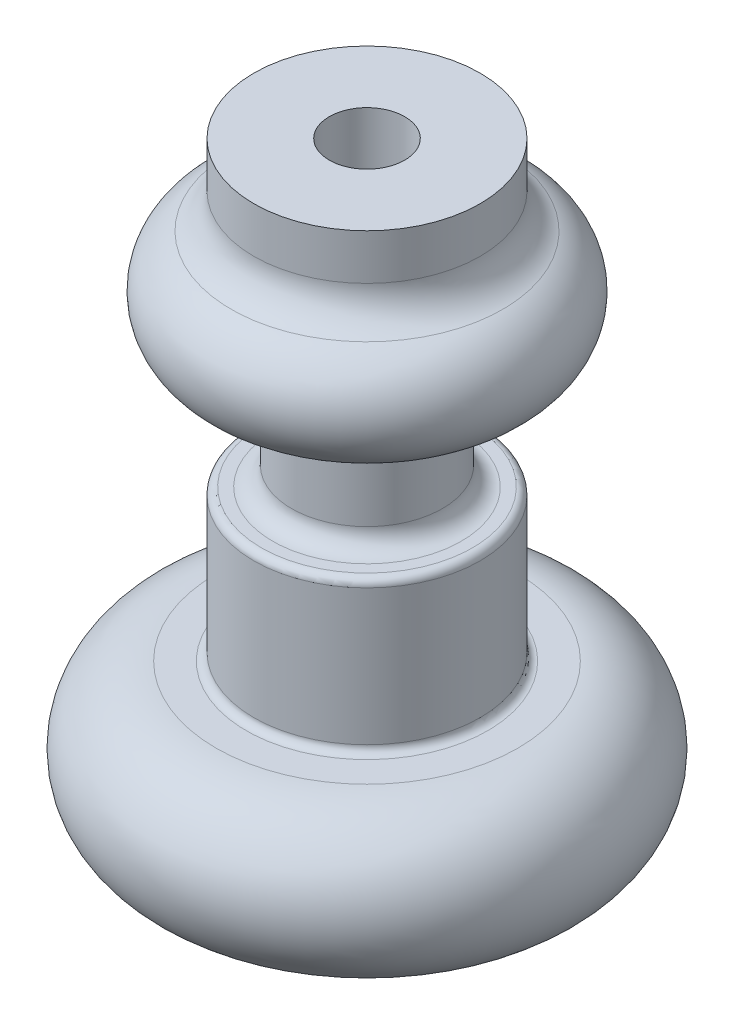
ISO-10303-21;
HEADER;
FILE_DESCRIPTION(('STEP AP214'),'2;1');
FILE_NAME('part.step','',(''),(''),'','','');
FILE_SCHEMA(('AUTOMOTIVE_DESIGN { 1 0 10303 214 1 1 1 1 }'));
ENDSEC;
DATA;
#1=APPLICATION_CONTEXT('core data for automotive mechanical design processes');
#2=APPLICATION_PROTOCOL_DEFINITION('international standard','automotive_design',2000,#1);
#3=PRODUCT_CONTEXT('',#1,'mechanical');
#4=PRODUCT('Part','Part','',(#3));
#5=PRODUCT_RELATED_PRODUCT_CATEGORY('part','',(#4));
#6=PRODUCT_DEFINITION_FORMATION('','',#4);
#7=PRODUCT_DEFINITION_CONTEXT('part definition',#1,'design');
#8=PRODUCT_DEFINITION('design','',#6,#7);
#9=PRODUCT_DEFINITION_SHAPE('','',#8);
#10=(LENGTH_UNIT() NAMED_UNIT(*) SI_UNIT(.MILLI.,.METRE.));
#11=(NAMED_UNIT(*) PLANE_ANGLE_UNIT() SI_UNIT($,.RADIAN.));
#12=(NAMED_UNIT(*) SI_UNIT($,.STERADIAN.) SOLID_ANGLE_UNIT());
#13=UNCERTAINTY_MEASURE_WITH_UNIT(LENGTH_MEASURE(1.E-05),#10,'distance_accuracy_value','');
#14=(GEOMETRIC_REPRESENTATION_CONTEXT(3) GLOBAL_UNCERTAINTY_ASSIGNED_CONTEXT((#13)) GLOBAL_UNIT_ASSIGNED_CONTEXT((#10,
#11,#12)) REPRESENTATION_CONTEXT('',''));
#15=CARTESIAN_POINT('',(0.,0.,0.));
#16=DIRECTION('',(0.,0.,1.));
#17=DIRECTION('',(1.,0.,0.));
#18=AXIS2_PLACEMENT_3D('',#15,#16,#17);
#19=CARTESIAN_POINT('',(10.,24.7857593924267,0.));
#20=DIRECTION('',(0.,1.,0.));
#21=DIRECTION('',(0.,0.,1.));
#22=AXIS2_PLACEMENT_3D('',#19,#20,#21);
#23=PLANE('',#22);
#24=CARTESIAN_POINT('',(0.,24.7857593924267,0.));
#25=DIRECTION('',(0.,-1.,0.));
#26=DIRECTION('',(0.,0.,-1.));
#27=AXIS2_PLACEMENT_3D('',#24,#25,#26);
#28=CIRCLE('',#27,10.);
#29=CARTESIAN_POINT('',(0.,24.7857593924267,-10.));
#30=VERTEX_POINT('',#29);
#31=EDGE_CURVE('E10',#30,#30,#28,.T.);
#32=ORIENTED_EDGE('',*,*,#31,.F.);
#33=EDGE_LOOP('',(#32));
#34=FACE_BOUND('',#33,.T.);
#35=ADVANCED_FACE('F35',(#34),#23,.T.);
#36=CARTESIAN_POINT('',(0.,0.,0.));
#37=DIRECTION('',(0.,-1.,0.));
#38=DIRECTION('',(0.,0.,-1.));
#39=AXIS2_PLACEMENT_3D('',#36,#37,#38);
#40=CYLINDRICAL_SURFACE('',#39,10.);
#41=ORIENTED_EDGE('',*,*,#31,.T.);
#42=EDGE_LOOP('',(#41));
#43=FACE_BOUND('',#42,.T.);
#44=CARTESIAN_POINT('',(0.,64.7857593924267,0.));
#45=DIRECTION('',(0.,-1.,0.));
#46=DIRECTION('',(0.,0.,-1.));
#47=AXIS2_PLACEMENT_3D('',#44,#45,#46);
#48=CIRCLE('',#47,9.99999999999999);
#49=CARTESIAN_POINT('',(0.,64.7857593924267,-9.99999999999999));
#50=VERTEX_POINT('',#49);
#51=EDGE_CURVE('E41',#50,#50,#48,.T.);
#52=ORIENTED_EDGE('',*,*,#51,.F.);
#53=EDGE_LOOP('',(#52));
#54=FACE_BOUND('',#53,.T.);
#55=ADVANCED_FACE('F104',(#43,#54),#40,.F.);
#56=CARTESIAN_POINT('',(30.,64.7857593924267,0.));
#57=DIRECTION('',(0.,1.,0.));
#58=DIRECTION('',(0.,0.,1.));
#59=AXIS2_PLACEMENT_3D('',#56,#57,#58);
#60=PLANE('',#59);
#61=ORIENTED_EDGE('',*,*,#51,.T.);
#62=EDGE_LOOP('',(#61));
#63=FACE_BOUND('',#62,.T.);
#64=CARTESIAN_POINT('',(0.,64.7857593924267,0.));
#65=DIRECTION('',(0.,-1.,0.));
#66=DIRECTION('',(0.,0.,-1.));
#67=AXIS2_PLACEMENT_3D('',#64,#65,#66);
#68=CIRCLE('',#67,30.);
#69=CARTESIAN_POINT('',(0.,64.7857593924267,-30.));
#70=VERTEX_POINT('',#69);
#71=EDGE_CURVE('E45',#70,#70,#68,.T.);
#72=ORIENTED_EDGE('',*,*,#71,.F.);
#73=EDGE_LOOP('',(#72));
#74=FACE_BOUND('',#73,.T.);
#75=ADVANCED_FACE('F109',(#63,#74),#60,.T.);
#76=CARTESIAN_POINT('',(0.,0.,0.));
#77=DIRECTION('',(0.,-1.,0.));
#78=DIRECTION('',(0.,0.,-1.));
#79=AXIS2_PLACEMENT_3D('',#76,#77,#78);
#80=CYLINDRICAL_SURFACE('',#79,30.);
#81=ORIENTED_EDGE('',*,*,#71,.T.);
#82=EDGE_LOOP('',(#81));
#83=FACE_BOUND('',#82,.T.);
#84=CARTESIAN_POINT('',(0.,52.6986378672059,0.));
#85=DIRECTION('',(0.,-1.,0.));
#86=DIRECTION('',(0.,0.,-1.));
#87=AXIS2_PLACEMENT_3D('',#84,#85,#86);
#88=CIRCLE('',#87,30.);
#89=CARTESIAN_POINT('',(0.,52.6986378672059,-30.));
#90=VERTEX_POINT('',#89);
#91=EDGE_CURVE('E49',#90,#90,#88,.T.);
#92=ORIENTED_EDGE('',*,*,#91,.F.);
#93=EDGE_LOOP('',(#92));
#94=FACE_BOUND('',#93,.T.);
#95=ADVANCED_FACE('F113',(#83,#94),#80,.T.);
#96=CARTESIAN_POINT('',(0.,52.6986378672059,0.));
#97=DIRECTION('',(0.,-1.,0.));
#98=DIRECTION('',(0.,0.,-1.));
#99=AXIS2_PLACEMENT_3D('',#96,#97,#98);
#100=TOROIDAL_SURFACE('',#99,40.,10.);
#101=ORIENTED_EDGE('',*,*,#91,.T.);
#102=EDGE_LOOP('',(#101));
#103=FACE_BOUND('',#102,.T.);
#104=CARTESIAN_POINT('',(0.,43.5334864772942,0.));
#105=DIRECTION('',(0.,-1.,0.));
#106=DIRECTION('',(0.,0.,-1.));
#107=AXIS2_PLACEMENT_3D('',#104,#105,#106);
#108=CIRCLE('',#107,36.);
#109=CARTESIAN_POINT('',(0.,43.5334864772942,-36.));
#110=VERTEX_POINT('',#109);
#111=EDGE_CURVE('E54',#110,#110,#108,.T.);
#112=ORIENTED_EDGE('',*,*,#111,.F.);
#113=EDGE_LOOP('',(#112));
#114=FACE_BOUND('',#113,.T.);
#115=ADVANCED_FACE('F119',(#103,#114),#100,.F.);
#116=CARTESIAN_POINT('',(0.,29.7857593924267,0.));
#117=DIRECTION('',(0.,-1.,0.));
#118=DIRECTION('',(0.,0.,-1.));
#119=AXIS2_PLACEMENT_3D('',#116,#117,#118);
#120=TOROIDAL_SURFACE('',#119,30.,15.);
#121=ORIENTED_EDGE('',*,*,#111,.T.);
#122=EDGE_LOOP('',(#121));
#123=FACE_BOUND('',#122,.T.);
#124=CARTESIAN_POINT('',(0.,14.7857593924267,0.));
#125=DIRECTION('',(0.,-1.,0.));
#126=DIRECTION('',(0.,0.,-1.));
#127=AXIS2_PLACEMENT_3D('',#124,#125,#126);
#128=CIRCLE('',#127,30.);
#129=CARTESIAN_POINT('',(0.,14.7857593924267,-30.));
#130=VERTEX_POINT('',#129);
#131=EDGE_CURVE('E57',#130,#130,#128,.T.);
#132=ORIENTED_EDGE('',*,*,#131,.F.);
#133=EDGE_LOOP('',(#132));
#134=FACE_BOUND('',#133,.T.);
#135=ADVANCED_FACE('F123',(#123,#134),#120,.T.);
#136=CARTESIAN_POINT('',(0.,4.7857593924267,0.));
#137=DIRECTION('',(0.,-1.,0.));
#138=DIRECTION('',(0.,0.,-1.));
#139=AXIS2_PLACEMENT_3D('',#136,#137,#138);
#140=TOROIDAL_SURFACE('',#139,30.,10.);
#141=ORIENTED_EDGE('',*,*,#131,.T.);
#142=EDGE_LOOP('',(#141));
#143=FACE_BOUND('',#142,.T.);
#144=CARTESIAN_POINT('',(0.,4.7857593924267,0.));
#145=DIRECTION('',(0.,-1.,0.));
#146=DIRECTION('',(0.,0.,-1.));
#147=AXIS2_PLACEMENT_3D('',#144,#145,#146);
#148=CIRCLE('',#147,20.);
#149=CARTESIAN_POINT('',(0.,4.7857593924267,-20.));
#150=VERTEX_POINT('',#149);
#151=EDGE_CURVE('E60',#150,#150,#148,.T.);
#152=ORIENTED_EDGE('',*,*,#151,.F.);
#153=EDGE_LOOP('',(#152));
#154=FACE_BOUND('',#153,.T.);
#155=ADVANCED_FACE('F127',(#143,#154),#140,.F.);
#156=CARTESIAN_POINT('',(0.,0.,0.));
#157=DIRECTION('',(0.,-1.,0.));
#158=DIRECTION('',(0.,0.,-1.));
#159=AXIS2_PLACEMENT_3D('',#156,#157,#158);
#160=CYLINDRICAL_SURFACE('',#159,20.);
#161=ORIENTED_EDGE('',*,*,#151,.T.);
#162=EDGE_LOOP('',(#161));
#163=FACE_BOUND('',#162,.T.);
#164=CARTESIAN_POINT('',(0.,-10.2142406075733,0.));
#165=DIRECTION('',(0.,-1.,0.));
#166=DIRECTION('',(0.,0.,-1.));
#167=AXIS2_PLACEMENT_3D('',#164,#165,#166);
#168=CIRCLE('',#167,20.);
#169=CARTESIAN_POINT('',(0.,-10.2142406075733,-20.));
#170=VERTEX_POINT('',#169);
#171=EDGE_CURVE('E63',#170,#170,#168,.T.);
#172=ORIENTED_EDGE('',*,*,#171,.F.);
#173=EDGE_LOOP('',(#172));
#174=FACE_BOUND('',#173,.T.);
#175=ADVANCED_FACE('F131',(#163,#174),#160,.T.);
#176=CARTESIAN_POINT('',(0.,-10.2142406075733,0.));
#177=DIRECTION('',(0.,-1.,0.));
#178=DIRECTION('',(0.,0.,-1.));
#179=AXIS2_PLACEMENT_3D('',#176,#177,#178);
#180=TOROIDAL_SURFACE('',#179,25.,5.);
#181=ORIENTED_EDGE('',*,*,#171,.T.);
#182=EDGE_LOOP('',(#181));
#183=FACE_BOUND('',#182,.T.);
#184=CARTESIAN_POINT('',(0.,-15.2142406075733,0.));
#185=DIRECTION('',(0.,-1.,0.));
#186=DIRECTION('',(0.,0.,-1.));
#187=AXIS2_PLACEMENT_3D('',#184,#185,#186);
#188=CIRCLE('',#187,25.);
#189=CARTESIAN_POINT('',(0.,-15.2142406075733,-25.));
#190=VERTEX_POINT('',#189);
#191=EDGE_CURVE('E66',#190,#190,#188,.T.);
#192=ORIENTED_EDGE('',*,*,#191,.F.);
#193=EDGE_LOOP('',(#192));
#194=FACE_BOUND('',#193,.T.);
#195=ADVANCED_FACE('F135',(#183,#194),#180,.F.);
#196=CARTESIAN_POINT('',(28.,-15.2142406075733,0.));
#197=DIRECTION('',(0.,1.,0.));
#198=DIRECTION('',(0.,0.,1.));
#199=AXIS2_PLACEMENT_3D('',#196,#197,#198);
#200=PLANE('',#199);
#201=ORIENTED_EDGE('',*,*,#191,.T.);
#202=EDGE_LOOP('',(#201));
#203=FACE_BOUND('',#202,.T.);
#204=CARTESIAN_POINT('',(0.,-15.2142406075733,0.));
#205=DIRECTION('',(0.,-1.,0.));
#206=DIRECTION('',(0.,0.,-1.));
#207=AXIS2_PLACEMENT_3D('',#204,#205,#206);
#208=CIRCLE('',#207,28.);
#209=CARTESIAN_POINT('',(0.,-15.2142406075733,-28.));
#210=VERTEX_POINT('',#209);
#211=EDGE_CURVE('E69',#210,#210,#208,.T.);
#212=ORIENTED_EDGE('',*,*,#211,.F.);
#213=EDGE_LOOP('',(#212));
#214=FACE_BOUND('',#213,.T.);
#215=ADVANCED_FACE('F139',(#203,#214),#200,.T.);
#216=CARTESIAN_POINT('',(0.,-17.2142406075733,0.));
#217=DIRECTION('',(0.,-1.,0.));
#218=DIRECTION('',(0.,0.,-1.));
#219=AXIS2_PLACEMENT_3D('',#216,#217,#218);
#220=TOROIDAL_SURFACE('',#219,28.,2.);
#221=ORIENTED_EDGE('',*,*,#211,.T.);
#222=EDGE_LOOP('',(#221));
#223=FACE_BOUND('',#222,.T.);
#224=CARTESIAN_POINT('',(0.,-17.2142406075733,0.));
#225=DIRECTION('',(0.,-1.,0.));
#226=DIRECTION('',(0.,0.,-1.));
#227=AXIS2_PLACEMENT_3D('',#224,#225,#226);
#228=CIRCLE('',#227,30.);
#229=CARTESIAN_POINT('',(0.,-17.2142406075733,-30.));
#230=VERTEX_POINT('',#229);
#231=EDGE_CURVE('E72',#230,#230,#228,.T.);
#232=ORIENTED_EDGE('',*,*,#231,.F.);
#233=EDGE_LOOP('',(#232));
#234=FACE_BOUND('',#233,.T.);
#235=ADVANCED_FACE('F143',(#223,#234),#220,.T.);
#236=CARTESIAN_POINT('',(0.,0.,0.));
#237=DIRECTION('',(0.,-1.,0.));
#238=DIRECTION('',(0.,0.,-1.));
#239=AXIS2_PLACEMENT_3D('',#236,#237,#238);
#240=CYLINDRICAL_SURFACE('',#239,30.);
#241=ORIENTED_EDGE('',*,*,#231,.T.);
#242=EDGE_LOOP('',(#241));
#243=FACE_BOUND('',#242,.T.);
#244=CARTESIAN_POINT('',(0.,-53.2142406075733,0.));
#245=DIRECTION('',(0.,-1.,0.));
#246=DIRECTION('',(0.,0.,-1.));
#247=AXIS2_PLACEMENT_3D('',#244,#245,#246);
#248=CIRCLE('',#247,30.);
#249=CARTESIAN_POINT('',(0.,-53.2142406075733,-30.));
#250=VERTEX_POINT('',#249);
#251=EDGE_CURVE('E75',#250,#250,#248,.T.);
#252=ORIENTED_EDGE('',*,*,#251,.F.);
#253=EDGE_LOOP('',(#252));
#254=FACE_BOUND('',#253,.T.);
#255=ADVANCED_FACE('F147',(#243,#254),#240,.T.);
#256=CARTESIAN_POINT('',(0.,-53.2142406075733,0.));
#257=DIRECTION('',(0.,-1.,0.));
#258=DIRECTION('',(0.,0.,-1.));
#259=AXIS2_PLACEMENT_3D('',#256,#257,#258);
#260=TOROIDAL_SURFACE('',#259,32.,2.);
#261=ORIENTED_EDGE('',*,*,#251,.T.);
#262=EDGE_LOOP('',(#261));
#263=FACE_BOUND('',#262,.T.);
#264=CARTESIAN_POINT('',(0.,-55.2142406075733,0.));
#265=DIRECTION('',(0.,-1.,0.));
#266=DIRECTION('',(0.,0.,-1.));
#267=AXIS2_PLACEMENT_3D('',#264,#265,#266);
#268=CIRCLE('',#267,32.);
#269=CARTESIAN_POINT('',(0.,-55.2142406075733,-32.));
#270=VERTEX_POINT('',#269);
#271=EDGE_CURVE('E78',#270,#270,#268,.T.);
#272=ORIENTED_EDGE('',*,*,#271,.F.);
#273=EDGE_LOOP('',(#272));
#274=FACE_BOUND('',#273,.T.);
#275=ADVANCED_FACE('F100',(#263,#274),#260,.F.);
#276=CARTESIAN_POINT('',(40.,-55.2142406075733,0.));
#277=DIRECTION('',(0.,1.,0.));
#278=DIRECTION('',(0.,0.,1.));
#279=AXIS2_PLACEMENT_3D('',#276,#277,#278);
#280=PLANE('',#279);
#281=ORIENTED_EDGE('',*,*,#271,.T.);
#282=EDGE_LOOP('',(#281));
#283=FACE_BOUND('',#282,.T.);
#284=CARTESIAN_POINT('',(0.,-55.2142406075733,0.));
#285=DIRECTION('',(0.,-1.,0.));
#286=DIRECTION('',(0.,0.,-1.));
#287=AXIS2_PLACEMENT_3D('',#284,#285,#286);
#288=CIRCLE('',#287,40.);
#289=CARTESIAN_POINT('',(0.,-55.2142406075733,-40.));
#290=VERTEX_POINT('',#289);
#291=EDGE_CURVE('E81',#290,#290,#288,.T.);
#292=ORIENTED_EDGE('',*,*,#291,.F.);
#293=EDGE_LOOP('',(#292));
#294=FACE_BOUND('',#293,.T.);
#295=ADVANCED_FACE('F92',(#283,#294),#280,.T.);
#296=CARTESIAN_POINT('',(0.,-75.2142406075733,0.));
#297=DIRECTION('',(0.,-1.,0.));
#298=DIRECTION('',(0.,0.,-1.));
#299=AXIS2_PLACEMENT_3D('',#296,#297,#298);
#300=TOROIDAL_SURFACE('',#299,40.,20.);
#301=ORIENTED_EDGE('',*,*,#291,.T.);
#302=EDGE_LOOP('',(#301));
#303=FACE_BOUND('',#302,.T.);
#304=CARTESIAN_POINT('',(0.,-95.2142406075733,0.));
#305=DIRECTION('',(0.,-1.,0.));
#306=DIRECTION('',(0.,0.,-1.));
#307=AXIS2_PLACEMENT_3D('',#304,#305,#306);
#308=CIRCLE('',#307,40.);
#309=CARTESIAN_POINT('',(0.,-95.2142406075733,-40.));
#310=VERTEX_POINT('',#309);
#311=EDGE_CURVE('E84',#310,#310,#308,.T.);
#312=ORIENTED_EDGE('',*,*,#311,.F.);
#313=EDGE_LOOP('',(#312));
#314=FACE_BOUND('',#313,.T.);
#315=ADVANCED_FACE('F90',(#303,#314),#300,.T.);
#316=CARTESIAN_POINT('',(0.,-95.2142406075733,0.));
#317=DIRECTION('',(0.,-1.,0.));
#318=DIRECTION('',(0.,0.,-1.));
#319=AXIS2_PLACEMENT_3D('',#316,#317,#318);
#320=PLANE('',#319);
#321=ORIENTED_EDGE('',*,*,#311,.T.);
#322=EDGE_LOOP('',(#321));
#323=FACE_BOUND('',#322,.T.);
#324=ADVANCED_FACE('F88',(#323),#320,.T.);
#325=CLOSED_SHELL('',(#35,#55,#75,#95,#115,#135,#155,#175,#195,#215,#235,#255,#275,#295,#315,#324));
#326=MANIFOLD_SOLID_BREP('B2',#325);
#327=ADVANCED_BREP_SHAPE_REPRESENTATION('',(#18,#326),#14);
#328=SHAPE_DEFINITION_REPRESENTATION(#9,#327);
ENDSEC;
END-ISO-10303-21;
